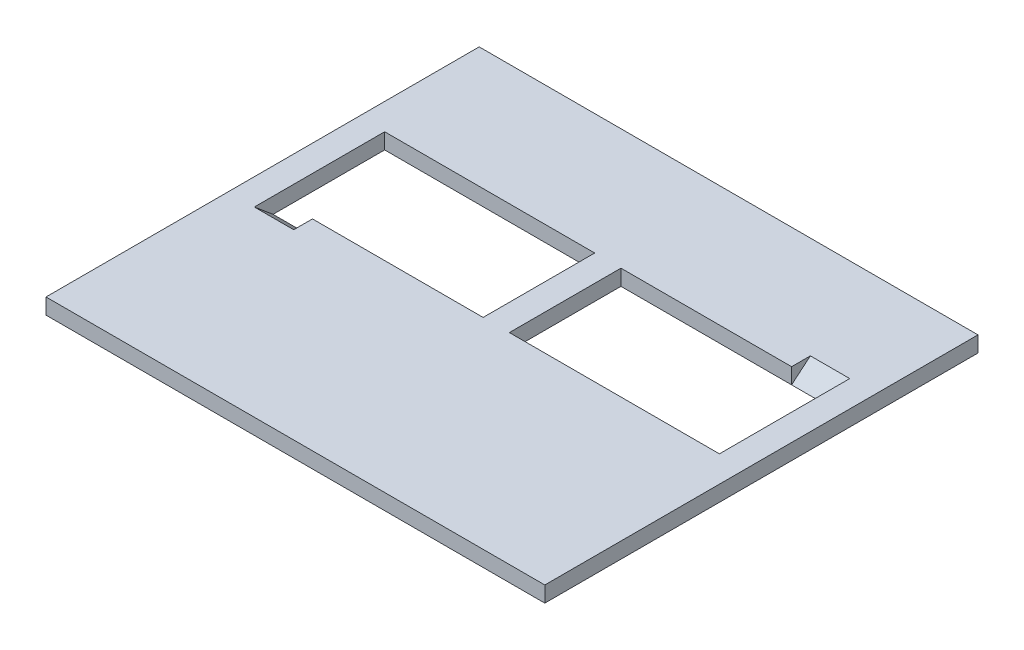
ISO-10303-21;
HEADER;
FILE_DESCRIPTION(('STEP AP214'),'2;1');
FILE_NAME('part.step','',(''),(''),'','','');
FILE_SCHEMA(('AUTOMOTIVE_DESIGN { 1 0 10303 214 1 1 1 1 }'));
ENDSEC;
DATA;
#1=APPLICATION_CONTEXT('core data for automotive mechanical design processes');
#2=APPLICATION_PROTOCOL_DEFINITION('international standard','automotive_design',2000,#1);
#3=PRODUCT_CONTEXT('',#1,'mechanical');
#4=PRODUCT('Part','Part','',(#3));
#5=PRODUCT_RELATED_PRODUCT_CATEGORY('part','',(#4));
#6=PRODUCT_DEFINITION_FORMATION('','',#4);
#7=PRODUCT_DEFINITION_CONTEXT('part definition',#1,'design');
#8=PRODUCT_DEFINITION('design','',#6,#7);
#9=PRODUCT_DEFINITION_SHAPE('','',#8);
#10=(LENGTH_UNIT() NAMED_UNIT(*) SI_UNIT(.MILLI.,.METRE.));
#11=(NAMED_UNIT(*) PLANE_ANGLE_UNIT() SI_UNIT($,.RADIAN.));
#12=(NAMED_UNIT(*) SI_UNIT($,.STERADIAN.) SOLID_ANGLE_UNIT());
#13=UNCERTAINTY_MEASURE_WITH_UNIT(LENGTH_MEASURE(1.E-05),#10,'distance_accuracy_value','');
#14=(GEOMETRIC_REPRESENTATION_CONTEXT(3) GLOBAL_UNCERTAINTY_ASSIGNED_CONTEXT((#13)) GLOBAL_UNIT_ASSIGNED_CONTEXT((#10,
#11,#12)) REPRESENTATION_CONTEXT('',''));
#15=CARTESIAN_POINT('',(0.,0.,0.));
#16=DIRECTION('',(0.,0.,1.));
#17=DIRECTION('',(1.,0.,0.));
#18=AXIS2_PLACEMENT_3D('',#15,#16,#17);
#19=CARTESIAN_POINT('',(0.,6.,0.));
#20=DIRECTION('',(0.,-1.,0.));
#21=DIRECTION('',(0.,0.,-1.));
#22=AXIS2_PLACEMENT_3D('',#19,#20,#21);
#23=PLANE('',#22);
#24=DIRECTION('',(0.,0.,1.));
#25=VECTOR('',#24,1.);
#26=CARTESIAN_POINT('',(-95.,6.,-82.5));
#27=LINE('',#26,#25);
#28=CARTESIAN_POINT('',(-95.,6.,-82.5));
#29=VERTEX_POINT('',#28);
#30=CARTESIAN_POINT('',(-95.,6.,82.5));
#31=VERTEX_POINT('',#30);
#32=EDGE_CURVE('E192',#29,#31,#27,.T.);
#33=ORIENTED_EDGE('',*,*,#32,.T.);
#34=DIRECTION('',(1.,0.,0.));
#35=VECTOR('',#34,1.);
#36=CARTESIAN_POINT('',(95.,6.,82.5));
#37=LINE('',#36,#35);
#38=CARTESIAN_POINT('',(95.,6.,82.5));
#39=VERTEX_POINT('',#38);
#40=EDGE_CURVE('E195',#31,#39,#37,.T.);
#41=ORIENTED_EDGE('',*,*,#40,.T.);
#42=DIRECTION('',(0.,0.,-1.));
#43=VECTOR('',#42,1.);
#44=CARTESIAN_POINT('',(95.,6.,-82.5));
#45=LINE('',#44,#43);
#46=CARTESIAN_POINT('',(95.,6.,-82.5));
#47=VERTEX_POINT('',#46);
#48=EDGE_CURVE('E198',#39,#47,#45,.T.);
#49=ORIENTED_EDGE('',*,*,#48,.T.);
#50=DIRECTION('',(-1.,0.,0.));
#51=VECTOR('',#50,1.);
#52=CARTESIAN_POINT('',(95.,6.,-82.5));
#53=LINE('',#52,#51);
#54=EDGE_CURVE('E200',#47,#29,#53,.T.);
#55=ORIENTED_EDGE('',*,*,#54,.T.);
#56=EDGE_LOOP('',(#33,#41,#49,#55));
#57=FACE_BOUND('',#56,.T.);
#58=DIRECTION('',(1.,0.,0.));
#59=VECTOR('',#58,1.);
#60=CARTESIAN_POINT('',(-85.,6.,6.));
#61=LINE('',#60,#59);
#62=CARTESIAN_POINT('',(-70.,6.,6.));
#63=VERTEX_POINT('',#62);
#64=CARTESIAN_POINT('',(-5.,6.,6.));
#65=VERTEX_POINT('',#64);
#66=EDGE_CURVE('E156',#63,#65,#61,.T.);
#67=ORIENTED_EDGE('',*,*,#66,.F.);
#68=DIRECTION('',(0.,0.,1.));
#69=VECTOR('',#68,1.);
#70=CARTESIAN_POINT('',(-70.,6.,6.));
#71=LINE('',#70,#69);
#72=CARTESIAN_POINT('',(-70.,6.,13.1505215555652));
#73=VERTEX_POINT('',#72);
#74=EDGE_CURVE('E143',#63,#73,#71,.T.);
#75=ORIENTED_EDGE('',*,*,#74,.T.);
#76=DIRECTION('',(-1.,0.,0.));
#77=VECTOR('',#76,1.);
#78=CARTESIAN_POINT('',(-70.,6.,13.1505215555652));
#79=LINE('',#78,#77);
#80=CARTESIAN_POINT('',(-85.,6.,13.1505215555652));
#81=VERTEX_POINT('',#80);
#82=EDGE_CURVE('E281',#73,#81,#79,.T.);
#83=ORIENTED_EDGE('',*,*,#82,.T.);
#84=DIRECTION('',(0.,0.,1.));
#85=VECTOR('',#84,1.);
#86=CARTESIAN_POINT('',(-85.,6.,-36.5));
#87=LINE('',#86,#85);
#88=CARTESIAN_POINT('',(-85.,6.,-36.5));
#89=VERTEX_POINT('',#88);
#90=EDGE_CURVE('E167',#89,#81,#87,.T.);
#91=ORIENTED_EDGE('',*,*,#90,.F.);
#92=DIRECTION('',(-1.,0.,0.));
#93=VECTOR('',#92,1.);
#94=CARTESIAN_POINT('',(-85.,6.,-36.5));
#95=LINE('',#94,#93);
#96=CARTESIAN_POINT('',(-5.,6.,-36.5));
#97=VERTEX_POINT('',#96);
#98=EDGE_CURVE('E171',#97,#89,#95,.T.);
#99=ORIENTED_EDGE('',*,*,#98,.F.);
#100=DIRECTION('',(0.,0.,-1.));
#101=VECTOR('',#100,1.);
#102=CARTESIAN_POINT('',(-5.,6.,-36.5));
#103=LINE('',#102,#101);
#104=EDGE_CURVE('E165',#65,#97,#103,.T.);
#105=ORIENTED_EDGE('',*,*,#104,.F.);
#106=EDGE_LOOP('',(#67,#75,#83,#91,#99,#105));
#107=FACE_BOUND('',#106,.T.);
#108=DIRECTION('',(0.,0.,-1.));
#109=VECTOR('',#108,1.);
#110=CARTESIAN_POINT('',(70.,6.,-36.5));
#111=LINE('',#110,#109);
#112=CARTESIAN_POINT('',(70.,6.,-36.5));
#113=VERTEX_POINT('',#112);
#114=CARTESIAN_POINT('',(70.,6.,-43.6505215555654));
#115=VERTEX_POINT('',#114);
#116=EDGE_CURVE('E284',#113,#115,#111,.T.);
#117=ORIENTED_EDGE('',*,*,#116,.T.);
#118=DIRECTION('',(1.,0.,0.));
#119=VECTOR('',#118,1.);
#120=CARTESIAN_POINT('',(70.,6.,-43.6505215555654));
#121=LINE('',#120,#119);
#122=CARTESIAN_POINT('',(85.,6.,-43.6505215555654));
#123=VERTEX_POINT('',#122);
#124=EDGE_CURVE('E292',#115,#123,#121,.T.);
#125=ORIENTED_EDGE('',*,*,#124,.T.);
#126=DIRECTION('',(0.,0.,-1.));
#127=VECTOR('',#126,1.);
#128=CARTESIAN_POINT('',(85.,6.,-36.5));
#129=LINE('',#128,#127);
#130=CARTESIAN_POINT('',(85.,6.,6.));
#131=VERTEX_POINT('',#130);
#132=EDGE_CURVE('E296',#131,#123,#129,.T.);
#133=ORIENTED_EDGE('',*,*,#132,.F.);
#134=DIRECTION('',(1.,0.,0.));
#135=VECTOR('',#134,1.);
#136=CARTESIAN_POINT('',(85.,6.,6.));
#137=LINE('',#136,#135);
#138=CARTESIAN_POINT('',(5.,6.,6.));
#139=VERTEX_POINT('',#138);
#140=EDGE_CURVE('E303',#139,#131,#137,.T.);
#141=ORIENTED_EDGE('',*,*,#140,.F.);
#142=DIRECTION('',(0.,0.,1.));
#143=VECTOR('',#142,1.);
#144=CARTESIAN_POINT('',(5.,6.,-36.5));
#145=LINE('',#144,#143);
#146=CARTESIAN_POINT('',(5.,6.,-36.5));
#147=VERTEX_POINT('',#146);
#148=EDGE_CURVE('E301',#147,#139,#145,.T.);
#149=ORIENTED_EDGE('',*,*,#148,.F.);
#150=DIRECTION('',(-1.,0.,0.));
#151=VECTOR('',#150,1.);
#152=CARTESIAN_POINT('',(85.,6.,-36.5));
#153=LINE('',#152,#151);
#154=EDGE_CURVE('E298',#113,#147,#153,.T.);
#155=ORIENTED_EDGE('',*,*,#154,.F.);
#156=EDGE_LOOP('',(#117,#125,#133,#141,#149,#155));
#157=FACE_BOUND('',#156,.T.);
#158=ADVANCED_FACE('F33',(#57,#107,#157),#23,.F.);
#159=CARTESIAN_POINT('',(85.,6.,-36.5));
#160=DIRECTION('',(0.,0.,1.));
#161=DIRECTION('',(1.,0.,0.));
#162=AXIS2_PLACEMENT_3D('',#159,#160,#161);
#163=PLANE('',#162);
#164=DIRECTION('',(-1.,0.,0.));
#165=VECTOR('',#164,1.);
#166=CARTESIAN_POINT('',(85.,0.,-36.5));
#167=LINE('',#166,#165);
#168=CARTESIAN_POINT('',(70.,0.,-36.5));
#169=VERTEX_POINT('',#168);
#170=CARTESIAN_POINT('',(5.,0.,-36.5));
#171=VERTEX_POINT('',#170);
#172=EDGE_CURVE('E307',#169,#171,#167,.T.);
#173=ORIENTED_EDGE('',*,*,#172,.F.);
#174=DIRECTION('',(0.,1.,0.));
#175=VECTOR('',#174,1.);
#176=CARTESIAN_POINT('',(70.,0.,-36.5));
#177=LINE('',#176,#175);
#178=EDGE_CURVE('E289',#169,#113,#177,.T.);
#179=ORIENTED_EDGE('',*,*,#178,.T.);
#180=ORIENTED_EDGE('',*,*,#154,.T.);
#181=DIRECTION('',(0.,-1.,0.));
#182=VECTOR('',#181,1.);
#183=CARTESIAN_POINT('',(5.,6.,-36.5));
#184=LINE('',#183,#182);
#185=EDGE_CURVE('E179',#147,#171,#184,.T.);
#186=ORIENTED_EDGE('',*,*,#185,.T.);
#187=EDGE_LOOP('',(#173,#179,#180,#186));
#188=FACE_BOUND('',#187,.T.);
#189=ADVANCED_FACE('F243',(#188),#163,.T.);
#190=CARTESIAN_POINT('',(0.,0.,0.));
#191=DIRECTION('',(0.,-1.,0.));
#192=DIRECTION('',(0.,0.,-1.));
#193=AXIS2_PLACEMENT_3D('',#190,#191,#192);
#194=PLANE('',#193);
#195=DIRECTION('',(0.,0.,1.));
#196=VECTOR('',#195,1.);
#197=CARTESIAN_POINT('',(-95.,0.,-82.5));
#198=LINE('',#197,#196);
#199=CARTESIAN_POINT('',(-95.,0.,-82.5));
#200=VERTEX_POINT('',#199);
#201=CARTESIAN_POINT('',(-95.,0.,82.5));
#202=VERTEX_POINT('',#201);
#203=EDGE_CURVE('E191',#200,#202,#198,.T.);
#204=ORIENTED_EDGE('',*,*,#203,.F.);
#205=DIRECTION('',(-1.,0.,0.));
#206=VECTOR('',#205,1.);
#207=CARTESIAN_POINT('',(95.,0.,-82.5));
#208=LINE('',#207,#206);
#209=CARTESIAN_POINT('',(95.,0.,-82.5));
#210=VERTEX_POINT('',#209);
#211=EDGE_CURVE('E196',#210,#200,#208,.T.);
#212=ORIENTED_EDGE('',*,*,#211,.F.);
#213=DIRECTION('',(0.,0.,-1.));
#214=VECTOR('',#213,1.);
#215=CARTESIAN_POINT('',(95.,0.,-82.5));
#216=LINE('',#215,#214);
#217=CARTESIAN_POINT('',(95.,0.,82.5));
#218=VERTEX_POINT('',#217);
#219=EDGE_CURVE('E207',#218,#210,#216,.T.);
#220=ORIENTED_EDGE('',*,*,#219,.F.);
#221=DIRECTION('',(1.,0.,0.));
#222=VECTOR('',#221,1.);
#223=CARTESIAN_POINT('',(95.,0.,82.5));
#224=LINE('',#223,#222);
#225=EDGE_CURVE('E205',#202,#218,#224,.T.);
#226=ORIENTED_EDGE('',*,*,#225,.F.);
#227=EDGE_LOOP('',(#204,#212,#220,#226));
#228=FACE_BOUND('',#227,.T.);
#229=DIRECTION('',(1.,0.,0.));
#230=VECTOR('',#229,1.);
#231=CARTESIAN_POINT('',(-85.,0.,6.));
#232=LINE('',#231,#230);
#233=CARTESIAN_POINT('',(-85.,0.,6.));
#234=VERTEX_POINT('',#233);
#235=CARTESIAN_POINT('',(-70.,0.,6.));
#236=VERTEX_POINT('',#235);
#237=EDGE_CURVE('E185',#234,#236,#232,.T.);
#238=ORIENTED_EDGE('',*,*,#237,.T.);
#239=CARTESIAN_POINT('',(-5.,0.,6.));
#240=VERTEX_POINT('',#239);
#241=EDGE_CURVE('E158',#236,#240,#232,.T.);
#242=ORIENTED_EDGE('',*,*,#241,.T.);
#243=DIRECTION('',(0.,0.,-1.));
#244=VECTOR('',#243,1.);
#245=CARTESIAN_POINT('',(-5.,0.,-36.5));
#246=LINE('',#245,#244);
#247=CARTESIAN_POINT('',(-5.,0.,-36.5));
#248=VERTEX_POINT('',#247);
#249=EDGE_CURVE('E175',#240,#248,#246,.T.);
#250=ORIENTED_EDGE('',*,*,#249,.T.);
#251=DIRECTION('',(-1.,0.,0.));
#252=VECTOR('',#251,1.);
#253=CARTESIAN_POINT('',(-85.,0.,-36.5));
#254=LINE('',#253,#252);
#255=CARTESIAN_POINT('',(-85.,0.,-36.5));
#256=VERTEX_POINT('',#255);
#257=EDGE_CURVE('E178',#248,#256,#254,.T.);
#258=ORIENTED_EDGE('',*,*,#257,.T.);
#259=DIRECTION('',(0.,0.,1.));
#260=VECTOR('',#259,1.);
#261=CARTESIAN_POINT('',(-85.,0.,-36.5));
#262=LINE('',#261,#260);
#263=EDGE_CURVE('E182',#256,#234,#262,.T.);
#264=ORIENTED_EDGE('',*,*,#263,.T.);
#265=EDGE_LOOP('',(#238,#242,#250,#258,#264));
#266=FACE_BOUND('',#265,.T.);
#267=DIRECTION('',(1.,0.,0.));
#268=VECTOR('',#267,1.);
#269=CARTESIAN_POINT('',(85.,0.,6.));
#270=LINE('',#269,#268);
#271=CARTESIAN_POINT('',(5.,0.,6.));
#272=VERTEX_POINT('',#271);
#273=CARTESIAN_POINT('',(85.,0.,6.));
#274=VERTEX_POINT('',#273);
#275=EDGE_CURVE('E299',#272,#274,#270,.T.);
#276=ORIENTED_EDGE('',*,*,#275,.T.);
#277=DIRECTION('',(0.,0.,-1.));
#278=VECTOR('',#277,1.);
#279=CARTESIAN_POINT('',(85.,0.,-36.5));
#280=LINE('',#279,#278);
#281=CARTESIAN_POINT('',(85.,0.,-36.5));
#282=VERTEX_POINT('',#281);
#283=EDGE_CURVE('E56',#274,#282,#280,.T.);
#284=ORIENTED_EDGE('',*,*,#283,.T.);
#285=EDGE_CURVE('E308',#282,#169,#167,.T.);
#286=ORIENTED_EDGE('',*,*,#285,.T.);
#287=ORIENTED_EDGE('',*,*,#172,.T.);
#288=DIRECTION('',(0.,0.,1.));
#289=VECTOR('',#288,1.);
#290=CARTESIAN_POINT('',(5.,0.,-36.5));
#291=LINE('',#290,#289);
#292=EDGE_CURVE('E311',#171,#272,#291,.T.);
#293=ORIENTED_EDGE('',*,*,#292,.T.);
#294=EDGE_LOOP('',(#276,#284,#286,#287,#293));
#295=FACE_BOUND('',#294,.T.);
#296=ADVANCED_FACE('F225',(#228,#266,#295),#194,.T.);
#297=CARTESIAN_POINT('',(-95.,6.,-82.5));
#298=DIRECTION('',(1.,0.,0.));
#299=DIRECTION('',(0.,0.,-1.));
#300=AXIS2_PLACEMENT_3D('',#297,#298,#299);
#301=PLANE('',#300);
#302=ORIENTED_EDGE('',*,*,#203,.T.);
#303=DIRECTION('',(0.,-1.,0.));
#304=VECTOR('',#303,1.);
#305=CARTESIAN_POINT('',(-95.,6.,82.5));
#306=LINE('',#305,#304);
#307=EDGE_CURVE('E11',#31,#202,#306,.T.);
#308=ORIENTED_EDGE('',*,*,#307,.F.);
#309=ORIENTED_EDGE('',*,*,#32,.F.);
#310=DIRECTION('',(0.,-1.,0.));
#311=VECTOR('',#310,1.);
#312=CARTESIAN_POINT('',(-95.,6.,-82.5));
#313=LINE('',#312,#311);
#314=EDGE_CURVE('E202',#29,#200,#313,.T.);
#315=ORIENTED_EDGE('',*,*,#314,.T.);
#316=EDGE_LOOP('',(#302,#308,#309,#315));
#317=FACE_BOUND('',#316,.T.);
#318=ADVANCED_FACE('F35',(#317),#301,.F.);
#319=CARTESIAN_POINT('',(95.,6.,82.5));
#320=DIRECTION('',(0.,0.,-1.));
#321=DIRECTION('',(-1.,0.,0.));
#322=AXIS2_PLACEMENT_3D('',#319,#320,#321);
#323=PLANE('',#322);
#324=ORIENTED_EDGE('',*,*,#225,.T.);
#325=DIRECTION('',(0.,-1.,0.));
#326=VECTOR('',#325,1.);
#327=CARTESIAN_POINT('',(95.,6.,82.5));
#328=LINE('',#327,#326);
#329=EDGE_CURVE('E41',#39,#218,#328,.T.);
#330=ORIENTED_EDGE('',*,*,#329,.F.);
#331=ORIENTED_EDGE('',*,*,#40,.F.);
#332=ORIENTED_EDGE('',*,*,#307,.T.);
#333=EDGE_LOOP('',(#324,#330,#331,#332));
#334=FACE_BOUND('',#333,.T.);
#335=ADVANCED_FACE('F235',(#334),#323,.F.);
#336=CARTESIAN_POINT('',(95.,6.,-82.5));
#337=DIRECTION('',(-1.,0.,0.));
#338=DIRECTION('',(0.,0.,1.));
#339=AXIS2_PLACEMENT_3D('',#336,#337,#338);
#340=PLANE('',#339);
#341=ORIENTED_EDGE('',*,*,#219,.T.);
#342=DIRECTION('',(0.,-1.,0.));
#343=VECTOR('',#342,1.);
#344=CARTESIAN_POINT('',(95.,6.,-82.5));
#345=LINE('',#344,#343);
#346=EDGE_CURVE('E212',#47,#210,#345,.T.);
#347=ORIENTED_EDGE('',*,*,#346,.F.);
#348=ORIENTED_EDGE('',*,*,#48,.F.);
#349=ORIENTED_EDGE('',*,*,#329,.T.);
#350=EDGE_LOOP('',(#341,#347,#348,#349));
#351=FACE_BOUND('',#350,.T.);
#352=ADVANCED_FACE('F219',(#351),#340,.F.);
#353=CARTESIAN_POINT('',(95.,6.,-82.5));
#354=DIRECTION('',(0.,0.,1.));
#355=DIRECTION('',(1.,0.,0.));
#356=AXIS2_PLACEMENT_3D('',#353,#354,#355);
#357=PLANE('',#356);
#358=ORIENTED_EDGE('',*,*,#211,.T.);
#359=ORIENTED_EDGE('',*,*,#314,.F.);
#360=ORIENTED_EDGE('',*,*,#54,.F.);
#361=ORIENTED_EDGE('',*,*,#346,.T.);
#362=EDGE_LOOP('',(#358,#359,#360,#361));
#363=FACE_BOUND('',#362,.T.);
#364=ADVANCED_FACE('F229',(#363),#357,.F.);
#365=CARTESIAN_POINT('',(-5.,6.,-36.5));
#366=DIRECTION('',(-1.,0.,0.));
#367=DIRECTION('',(0.,0.,1.));
#368=AXIS2_PLACEMENT_3D('',#365,#366,#367);
#369=PLANE('',#368);
#370=ORIENTED_EDGE('',*,*,#249,.F.);
#371=DIRECTION('',(0.,-1.,0.));
#372=VECTOR('',#371,1.);
#373=CARTESIAN_POINT('',(-5.,6.,6.));
#374=LINE('',#373,#372);
#375=EDGE_CURVE('E166',#65,#240,#374,.T.);
#376=ORIENTED_EDGE('',*,*,#375,.F.);
#377=ORIENTED_EDGE('',*,*,#104,.T.);
#378=DIRECTION('',(0.,-1.,0.));
#379=VECTOR('',#378,1.);
#380=CARTESIAN_POINT('',(-5.,6.,-36.5));
#381=LINE('',#380,#379);
#382=EDGE_CURVE('E188',#97,#248,#381,.T.);
#383=ORIENTED_EDGE('',*,*,#382,.T.);
#384=EDGE_LOOP('',(#370,#376,#377,#383));
#385=FACE_BOUND('',#384,.T.);
#386=ADVANCED_FACE('F252',(#385),#369,.T.);
#387=CARTESIAN_POINT('',(-85.,6.,-36.5));
#388=DIRECTION('',(0.,0.,1.));
#389=DIRECTION('',(1.,0.,0.));
#390=AXIS2_PLACEMENT_3D('',#387,#388,#389);
#391=PLANE('',#390);
#392=ORIENTED_EDGE('',*,*,#257,.F.);
#393=ORIENTED_EDGE('',*,*,#382,.F.);
#394=ORIENTED_EDGE('',*,*,#98,.T.);
#395=DIRECTION('',(0.,-1.,0.));
#396=VECTOR('',#395,1.);
#397=CARTESIAN_POINT('',(-85.,6.,-36.5));
#398=LINE('',#397,#396);
#399=EDGE_CURVE('E169',#89,#256,#398,.T.);
#400=ORIENTED_EDGE('',*,*,#399,.T.);
#401=EDGE_LOOP('',(#392,#393,#394,#400));
#402=FACE_BOUND('',#401,.T.);
#403=ADVANCED_FACE('F260',(#402),#391,.T.);
#404=CARTESIAN_POINT('',(-85.,6.,-36.5));
#405=DIRECTION('',(1.,0.,0.));
#406=DIRECTION('',(0.,0.,-1.));
#407=AXIS2_PLACEMENT_3D('',#404,#405,#406);
#408=PLANE('',#407);
#409=ORIENTED_EDGE('',*,*,#263,.F.);
#410=ORIENTED_EDGE('',*,*,#399,.F.);
#411=ORIENTED_EDGE('',*,*,#90,.T.);
#412=DIRECTION('',(0.,-0.642787609686541,-0.766044443118977));
#413=VECTOR('',#412,1.);
#414=CARTESIAN_POINT('',(-85.,0.,6.));
#415=LINE('',#414,#413);
#416=EDGE_CURVE('E160',#81,#234,#415,.T.);
#417=ORIENTED_EDGE('',*,*,#416,.T.);
#418=EDGE_LOOP('',(#409,#410,#411,#417));
#419=FACE_BOUND('',#418,.T.);
#420=ADVANCED_FACE('F265',(#419),#408,.T.);
#421=CARTESIAN_POINT('',(-85.,6.,6.));
#422=DIRECTION('',(0.,0.,-1.));
#423=DIRECTION('',(-1.,0.,0.));
#424=AXIS2_PLACEMENT_3D('',#421,#422,#423);
#425=PLANE('',#424);
#426=DIRECTION('',(0.,1.,0.));
#427=VECTOR('',#426,1.);
#428=CARTESIAN_POINT('',(-70.,0.,6.));
#429=LINE('',#428,#427);
#430=EDGE_CURVE('E146',#236,#63,#429,.T.);
#431=ORIENTED_EDGE('',*,*,#430,.T.);
#432=ORIENTED_EDGE('',*,*,#66,.T.);
#433=ORIENTED_EDGE('',*,*,#375,.T.);
#434=ORIENTED_EDGE('',*,*,#241,.F.);
#435=EDGE_LOOP('',(#431,#432,#433,#434));
#436=FACE_BOUND('',#435,.T.);
#437=ADVANCED_FACE('F154',(#436),#425,.T.);
#438=CARTESIAN_POINT('',(85.,6.,-36.5));
#439=DIRECTION('',(-1.,0.,0.));
#440=DIRECTION('',(0.,0.,1.));
#441=AXIS2_PLACEMENT_3D('',#438,#439,#440);
#442=PLANE('',#441);
#443=ORIENTED_EDGE('',*,*,#283,.F.);
#444=DIRECTION('',(0.,-1.,0.));
#445=VECTOR('',#444,1.);
#446=CARTESIAN_POINT('',(85.,6.,6.));
#447=LINE('',#446,#445);
#448=EDGE_CURVE('E305',#131,#274,#447,.T.);
#449=ORIENTED_EDGE('',*,*,#448,.F.);
#450=ORIENTED_EDGE('',*,*,#132,.T.);
#451=DIRECTION('',(0.,-0.642787609686534,0.766044443118982));
#452=VECTOR('',#451,1.);
#453=CARTESIAN_POINT('',(85.,6.,-43.6505215555654));
#454=LINE('',#453,#452);
#455=EDGE_CURVE('E283',#123,#282,#454,.T.);
#456=ORIENTED_EDGE('',*,*,#455,.T.);
#457=EDGE_LOOP('',(#443,#449,#450,#456));
#458=FACE_BOUND('',#457,.T.);
#459=ADVANCED_FACE('F332',(#458),#442,.T.);
#460=CARTESIAN_POINT('',(5.,6.,-36.5));
#461=DIRECTION('',(1.,0.,0.));
#462=DIRECTION('',(0.,0.,-1.));
#463=AXIS2_PLACEMENT_3D('',#460,#461,#462);
#464=PLANE('',#463);
#465=ORIENTED_EDGE('',*,*,#292,.F.);
#466=ORIENTED_EDGE('',*,*,#185,.F.);
#467=ORIENTED_EDGE('',*,*,#148,.T.);
#468=DIRECTION('',(0.,-1.,0.));
#469=VECTOR('',#468,1.);
#470=CARTESIAN_POINT('',(5.,6.,6.));
#471=LINE('',#470,#469);
#472=EDGE_CURVE('E48',#139,#272,#471,.T.);
#473=ORIENTED_EDGE('',*,*,#472,.T.);
#474=EDGE_LOOP('',(#465,#466,#467,#473));
#475=FACE_BOUND('',#474,.T.);
#476=ADVANCED_FACE('F326',(#475),#464,.T.);
#477=CARTESIAN_POINT('',(85.,6.,6.));
#478=DIRECTION('',(0.,0.,-1.));
#479=DIRECTION('',(-1.,0.,0.));
#480=AXIS2_PLACEMENT_3D('',#477,#478,#479);
#481=PLANE('',#480);
#482=ORIENTED_EDGE('',*,*,#275,.F.);
#483=ORIENTED_EDGE('',*,*,#472,.F.);
#484=ORIENTED_EDGE('',*,*,#140,.T.);
#485=ORIENTED_EDGE('',*,*,#448,.T.);
#486=EDGE_LOOP('',(#482,#483,#484,#485));
#487=FACE_BOUND('',#486,.T.);
#488=ADVANCED_FACE('F344',(#487),#481,.T.);
#489=CARTESIAN_POINT('',(70.,6.,-43.6505215555654));
#490=DIRECTION('',(0.,0.766044443118982,0.642787609686534));
#491=DIRECTION('',(0.,-0.642787609686535,0.766044443118982));
#492=AXIS2_PLACEMENT_3D('',#489,#490,#491);
#493=PLANE('',#492);
#494=ORIENTED_EDGE('',*,*,#455,.F.);
#495=ORIENTED_EDGE('',*,*,#124,.F.);
#496=DIRECTION('',(0.,-0.642787609686534,0.766044443118982));
#497=VECTOR('',#496,1.);
#498=CARTESIAN_POINT('',(70.,6.,-43.6505215555654));
#499=LINE('',#498,#497);
#500=EDGE_CURVE('E287',#115,#169,#499,.T.);
#501=ORIENTED_EDGE('',*,*,#500,.T.);
#502=ORIENTED_EDGE('',*,*,#285,.F.);
#503=EDGE_LOOP('',(#494,#495,#501,#502));
#504=FACE_BOUND('',#503,.T.);
#505=ADVANCED_FACE('F329',(#504),#493,.T.);
#506=CARTESIAN_POINT('',(70.,0.,0.));
#507=DIRECTION('',(1.,0.,0.));
#508=DIRECTION('',(0.,0.,-1.));
#509=AXIS2_PLACEMENT_3D('',#506,#507,#508);
#510=PLANE('',#509);
#511=ORIENTED_EDGE('',*,*,#116,.F.);
#512=ORIENTED_EDGE('',*,*,#178,.F.);
#513=ORIENTED_EDGE('',*,*,#500,.F.);
#514=EDGE_LOOP('',(#511,#512,#513));
#515=FACE_BOUND('',#514,.T.);
#516=ADVANCED_FACE('F336',(#515),#510,.T.);
#517=CARTESIAN_POINT('',(-70.,0.,6.));
#518=DIRECTION('',(0.,0.766044443118977,-0.642787609686541));
#519=DIRECTION('',(0.,0.642787609686541,0.766044443118977));
#520=AXIS2_PLACEMENT_3D('',#517,#518,#519);
#521=PLANE('',#520);
#522=ORIENTED_EDGE('',*,*,#416,.F.);
#523=ORIENTED_EDGE('',*,*,#82,.F.);
#524=DIRECTION('',(0.,-0.642787609686541,-0.766044443118977));
#525=VECTOR('',#524,1.);
#526=CARTESIAN_POINT('',(-70.,0.,6.));
#527=LINE('',#526,#525);
#528=EDGE_CURVE('E148',#73,#236,#527,.T.);
#529=ORIENTED_EDGE('',*,*,#528,.T.);
#530=ORIENTED_EDGE('',*,*,#237,.F.);
#531=EDGE_LOOP('',(#522,#523,#529,#530));
#532=FACE_BOUND('',#531,.T.);
#533=ADVANCED_FACE('F274',(#532),#521,.T.);
#534=CARTESIAN_POINT('',(-70.,0.,0.));
#535=DIRECTION('',(1.,0.,0.));
#536=DIRECTION('',(0.,0.,-1.));
#537=AXIS2_PLACEMENT_3D('',#534,#535,#536);
#538=PLANE('',#537);
#539=ORIENTED_EDGE('',*,*,#430,.F.);
#540=ORIENTED_EDGE('',*,*,#528,.F.);
#541=ORIENTED_EDGE('',*,*,#74,.F.);
#542=EDGE_LOOP('',(#539,#540,#541));
#543=FACE_BOUND('',#542,.T.);
#544=ADVANCED_FACE('F145',(#543),#538,.F.);
#545=CLOSED_SHELL('',(#158,#189,#296,#318,#335,#352,#364,#386,#403,#420,#437,#459,#476,#488,
#505,#516,#533,#544));
#546=MANIFOLD_SOLID_BREP('B2',#545);
#547=ADVANCED_BREP_SHAPE_REPRESENTATION('',(#18,#546),#14);
#548=SHAPE_DEFINITION_REPRESENTATION(#9,#547);
ENDSEC;
END-ISO-10303-21;
